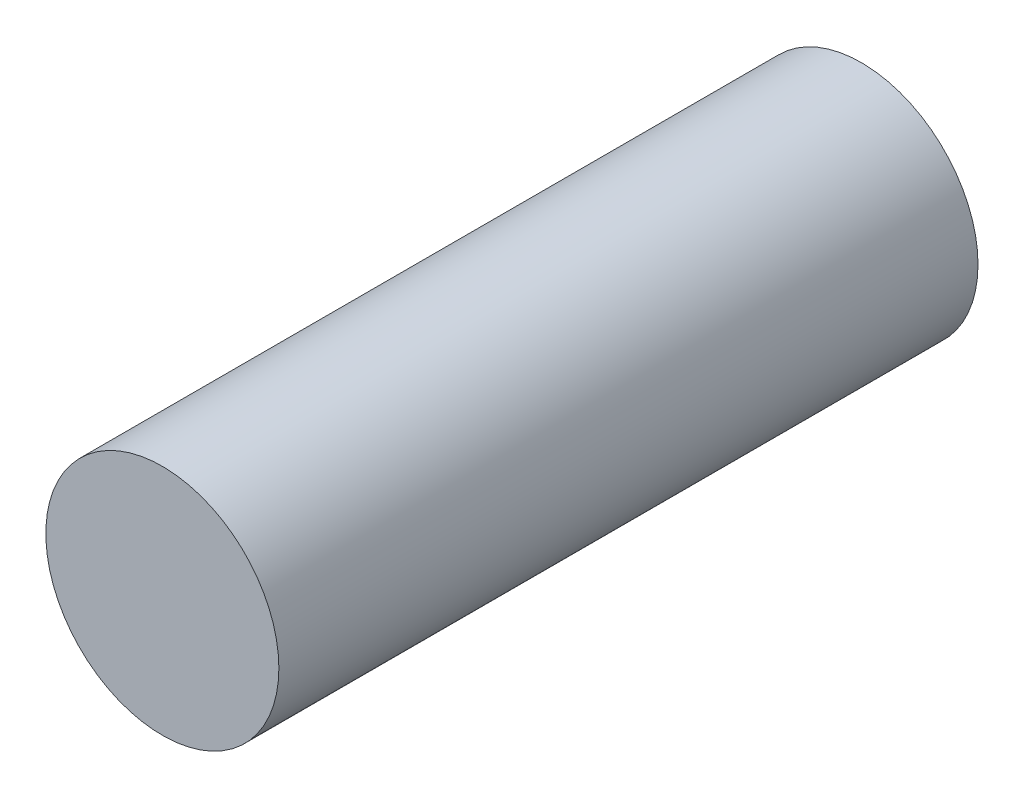
ISO-10303-21;
HEADER;
FILE_DESCRIPTION(('STEP AP214'),'2;1');
FILE_NAME('part.step','',(''),(''),'','','');
FILE_SCHEMA(('AUTOMOTIVE_DESIGN { 1 0 10303 214 1 1 1 1 }'));
ENDSEC;
DATA;
#1=APPLICATION_CONTEXT('core data for automotive mechanical design processes');
#2=APPLICATION_PROTOCOL_DEFINITION('international standard','automotive_design',2000,#1);
#3=PRODUCT_CONTEXT('',#1,'mechanical');
#4=PRODUCT('Part','Part','',(#3));
#5=PRODUCT_RELATED_PRODUCT_CATEGORY('part','',(#4));
#6=PRODUCT_DEFINITION_FORMATION('','',#4);
#7=PRODUCT_DEFINITION_CONTEXT('part definition',#1,'design');
#8=PRODUCT_DEFINITION('design','',#6,#7);
#9=PRODUCT_DEFINITION_SHAPE('','',#8);
#10=(LENGTH_UNIT() NAMED_UNIT(*) SI_UNIT(.MILLI.,.METRE.));
#11=(NAMED_UNIT(*) PLANE_ANGLE_UNIT() SI_UNIT($,.RADIAN.));
#12=(NAMED_UNIT(*) SI_UNIT($,.STERADIAN.) SOLID_ANGLE_UNIT());
#13=UNCERTAINTY_MEASURE_WITH_UNIT(LENGTH_MEASURE(1.E-05),#10,'distance_accuracy_value','');
#14=(GEOMETRIC_REPRESENTATION_CONTEXT(3) GLOBAL_UNCERTAINTY_ASSIGNED_CONTEXT((#13)) GLOBAL_UNIT_ASSIGNED_CONTEXT((#10,
#11,#12)) REPRESENTATION_CONTEXT('',''));
#15=CARTESIAN_POINT('',(0.,0.,0.));
#16=DIRECTION('',(0.,0.,1.));
#17=DIRECTION('',(1.,0.,0.));
#18=AXIS2_PLACEMENT_3D('',#15,#16,#17);
#19=CARTESIAN_POINT('',(0.,0.,60.));
#20=DIRECTION('',(0.,0.,-1.));
#21=DIRECTION('',(-1.,0.,0.));
#22=AXIS2_PLACEMENT_3D('',#19,#20,#21);
#23=CYLINDRICAL_SURFACE('',#22,10.);
#24=CARTESIAN_POINT('',(0.,0.,60.));
#25=DIRECTION('',(0.,0.,1.));
#26=DIRECTION('',(1.,0.,0.));
#27=AXIS2_PLACEMENT_3D('',#24,#25,#26);
#28=CIRCLE('',#27,10.);
#29=CARTESIAN_POINT('',(10.,0.,60.));
#30=VERTEX_POINT('',#29);
#31=EDGE_CURVE('E10',#30,#30,#28,.T.);
#32=ORIENTED_EDGE('',*,*,#31,.F.);
#33=EDGE_LOOP('',(#32));
#34=FACE_BOUND('',#33,.T.);
#35=CARTESIAN_POINT('',(0.,0.,0.));
#36=DIRECTION('',(0.,0.,1.));
#37=DIRECTION('',(1.,0.,0.));
#38=AXIS2_PLACEMENT_3D('',#35,#36,#37);
#39=CIRCLE('',#38,10.);
#40=CARTESIAN_POINT('',(10.,0.,0.));
#41=VERTEX_POINT('',#40);
#42=EDGE_CURVE('E40',#41,#41,#39,.T.);
#43=ORIENTED_EDGE('',*,*,#42,.T.);
#44=EDGE_LOOP('',(#43));
#45=FACE_BOUND('',#44,.T.);
#46=ADVANCED_FACE('F37',(#34,#45),#23,.T.);
#47=CARTESIAN_POINT('',(0.,0.,60.));
#48=DIRECTION('',(0.,0.,1.));
#49=DIRECTION('',(1.,0.,0.));
#50=AXIS2_PLACEMENT_3D('',#47,#48,#49);
#51=PLANE('',#50);
#52=ORIENTED_EDGE('',*,*,#31,.T.);
#53=EDGE_LOOP('',(#52));
#54=FACE_BOUND('',#53,.T.);
#55=ADVANCED_FACE('F66',(#54),#51,.T.);
#56=CARTESIAN_POINT('',(0.,0.,0.));
#57=DIRECTION('',(0.,0.,1.));
#58=DIRECTION('',(1.,0.,0.));
#59=AXIS2_PLACEMENT_3D('',#56,#57,#58);
#60=PLANE('',#59);
#61=CARTESIAN_POINT('',(0.,0.,0.));
#62=DIRECTION('',(0.,0.,-1.));
#63=DIRECTION('',(-1.,0.,0.));
#64=AXIS2_PLACEMENT_3D('',#61,#62,#63);
#65=CIRCLE('',#64,4.);
#66=CARTESIAN_POINT('',(-4.,0.,0.));
#67=VERTEX_POINT('',#66);
#68=EDGE_CURVE('E49',#67,#67,#65,.T.);
#69=ORIENTED_EDGE('',*,*,#68,.F.);
#70=EDGE_LOOP('',(#69));
#71=FACE_BOUND('',#70,.T.);
#72=ORIENTED_EDGE('',*,*,#42,.F.);
#73=EDGE_LOOP('',(#72));
#74=FACE_BOUND('',#73,.T.);
#75=ADVANCED_FACE('F60',(#71,#74),#60,.F.);
#76=CARTESIAN_POINT('',(0.,0.,10.));
#77=DIRECTION('',(0.,0.,-1.));
#78=DIRECTION('',(-1.,0.,0.));
#79=AXIS2_PLACEMENT_3D('',#76,#77,#78);
#80=CYLINDRICAL_SURFACE('',#79,4.);
#81=CARTESIAN_POINT('',(0.,0.,10.));
#82=DIRECTION('',(0.,0.,-1.));
#83=DIRECTION('',(-1.,0.,0.));
#84=AXIS2_PLACEMENT_3D('',#81,#82,#83);
#85=CIRCLE('',#84,4.);
#86=CARTESIAN_POINT('',(-4.,0.,10.));
#87=VERTEX_POINT('',#86);
#88=EDGE_CURVE('E47',#87,#87,#85,.T.);
#89=ORIENTED_EDGE('',*,*,#88,.F.);
#90=EDGE_LOOP('',(#89));
#91=FACE_BOUND('',#90,.T.);
#92=ORIENTED_EDGE('',*,*,#68,.T.);
#93=EDGE_LOOP('',(#92));
#94=FACE_BOUND('',#93,.T.);
#95=ADVANCED_FACE('F57',(#91,#94),#80,.F.);
#96=CARTESIAN_POINT('',(0.,0.,10.));
#97=DIRECTION('',(0.,0.,-1.));
#98=DIRECTION('',(-1.,0.,0.));
#99=AXIS2_PLACEMENT_3D('',#96,#97,#98);
#100=PLANE('',#99);
#101=ORIENTED_EDGE('',*,*,#88,.T.);
#102=EDGE_LOOP('',(#101));
#103=FACE_BOUND('',#102,.T.);
#104=ADVANCED_FACE('F55',(#103),#100,.T.);
#105=CLOSED_SHELL('',(#46,#55,#75,#95,#104));
#106=MANIFOLD_SOLID_BREP('B2',#105);
#107=ADVANCED_BREP_SHAPE_REPRESENTATION('',(#18,#106),#14);
#108=SHAPE_DEFINITION_REPRESENTATION(#9,#107);
ENDSEC;
END-ISO-10303-21;
